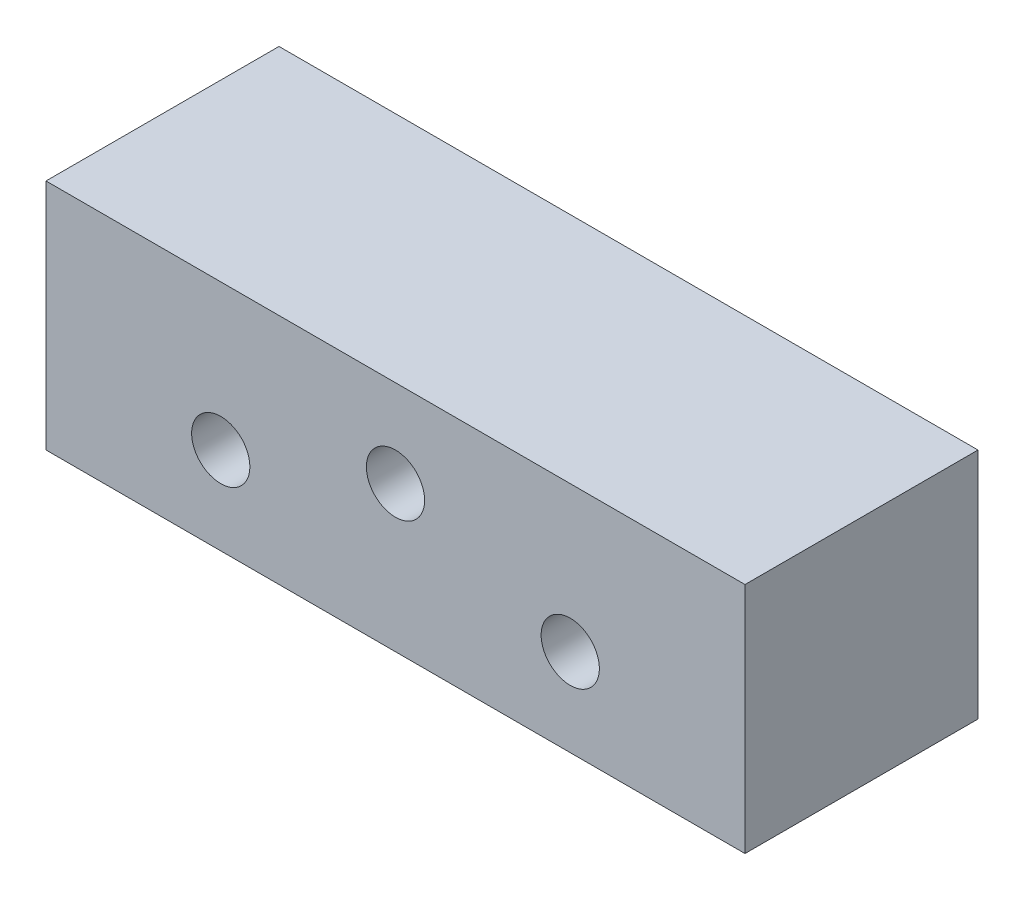
ISO-10303-21;
HEADER;
FILE_DESCRIPTION(('STEP AP214'),'2;1');
FILE_NAME('part.step','',(''),(''),'','','');
FILE_SCHEMA(('AUTOMOTIVE_DESIGN { 1 0 10303 214 1 1 1 1 }'));
ENDSEC;
DATA;
#1=APPLICATION_CONTEXT('core data for automotive mechanical design processes');
#2=APPLICATION_PROTOCOL_DEFINITION('international standard','automotive_design',2000,#1);
#3=PRODUCT_CONTEXT('',#1,'mechanical');
#4=PRODUCT('Part','Part','',(#3));
#5=PRODUCT_RELATED_PRODUCT_CATEGORY('part','',(#4));
#6=PRODUCT_DEFINITION_FORMATION('','',#4);
#7=PRODUCT_DEFINITION_CONTEXT('part definition',#1,'design');
#8=PRODUCT_DEFINITION('design','',#6,#7);
#9=PRODUCT_DEFINITION_SHAPE('','',#8);
#10=(LENGTH_UNIT() NAMED_UNIT(*) SI_UNIT(.MILLI.,.METRE.));
#11=(NAMED_UNIT(*) PLANE_ANGLE_UNIT() SI_UNIT($,.RADIAN.));
#12=(NAMED_UNIT(*) SI_UNIT($,.STERADIAN.) SOLID_ANGLE_UNIT());
#13=UNCERTAINTY_MEASURE_WITH_UNIT(LENGTH_MEASURE(1.E-05),#10,'distance_accuracy_value','');
#14=(GEOMETRIC_REPRESENTATION_CONTEXT(3) GLOBAL_UNCERTAINTY_ASSIGNED_CONTEXT((#13)) GLOBAL_UNIT_ASSIGNED_CONTEXT((#10,
#11,#12)) REPRESENTATION_CONTEXT('',''));
#15=CARTESIAN_POINT('',(0.,0.,0.));
#16=DIRECTION('',(0.,0.,1.));
#17=DIRECTION('',(1.,0.,0.));
#18=AXIS2_PLACEMENT_3D('',#15,#16,#17);
#19=CARTESIAN_POINT('',(0.,0.,40.));
#20=DIRECTION('',(0.,0.,1.));
#21=DIRECTION('',(1.,0.,0.));
#22=AXIS2_PLACEMENT_3D('',#19,#20,#21);
#23=PLANE('',#22);
#24=CARTESIAN_POINT('',(39.8281786941581,-25.,40.));
#25=DIRECTION('',(0.,0.,1.));
#26=DIRECTION('',(1.,0.,0.));
#27=AXIS2_PLACEMENT_3D('',#24,#25,#26);
#28=CIRCLE('',#27,5.);
#29=CARTESIAN_POINT('',(44.8281786941581,-25.,40.));
#30=VERTEX_POINT('',#29);
#31=EDGE_CURVE('E99',#30,#30,#28,.T.);
#32=ORIENTED_EDGE('',*,*,#31,.F.);
#33=EDGE_LOOP('',(#32));
#34=FACE_BOUND('',#33,.T.);
#35=DIRECTION('',(0.,-1.,0.));
#36=VECTOR('',#35,1.);
#37=CARTESIAN_POINT('',(-50.1718213058419,0.,40.));
#38=LINE('',#37,#36);
#39=CARTESIAN_POINT('',(-50.1718213058419,0.,40.));
#40=VERTEX_POINT('',#39);
#41=CARTESIAN_POINT('',(-50.1718213058419,-40.,40.));
#42=VERTEX_POINT('',#41);
#43=EDGE_CURVE('E69',#40,#42,#38,.T.);
#44=ORIENTED_EDGE('',*,*,#43,.T.);
#45=DIRECTION('',(1.,0.,0.));
#46=VECTOR('',#45,1.);
#47=CARTESIAN_POINT('',(-50.1718213058419,-40.,40.));
#48=LINE('',#47,#46);
#49=CARTESIAN_POINT('',(69.8281786941581,-40.,40.));
#50=VERTEX_POINT('',#49);
#51=EDGE_CURVE('E64',#42,#50,#48,.T.);
#52=ORIENTED_EDGE('',*,*,#51,.T.);
#53=DIRECTION('',(0.,1.,0.));
#54=VECTOR('',#53,1.);
#55=CARTESIAN_POINT('',(69.8281786941581,0.,40.));
#56=LINE('',#55,#54);
#57=CARTESIAN_POINT('',(69.8281786941581,0.,40.));
#58=VERTEX_POINT('',#57);
#59=EDGE_CURVE('E67',#50,#58,#56,.T.);
#60=ORIENTED_EDGE('',*,*,#59,.T.);
#61=DIRECTION('',(-1.,0.,0.));
#62=VECTOR('',#61,1.);
#63=CARTESIAN_POINT('',(-50.1718213058419,0.,40.));
#64=LINE('',#63,#62);
#65=EDGE_CURVE('E34',#58,#40,#64,.T.);
#66=ORIENTED_EDGE('',*,*,#65,.T.);
#67=EDGE_LOOP('',(#44,#52,#60,#66));
#68=FACE_BOUND('',#67,.T.);
#69=CARTESIAN_POINT('',(-20.1718213058419,-25.,40.));
#70=DIRECTION('',(0.,0.,1.));
#71=DIRECTION('',(1.,0.,0.));
#72=AXIS2_PLACEMENT_3D('',#69,#70,#71);
#73=CIRCLE('',#72,5.);
#74=CARTESIAN_POINT('',(-15.1718213058419,-25.,40.));
#75=VERTEX_POINT('',#74);
#76=EDGE_CURVE('E84',#75,#75,#73,.T.);
#77=ORIENTED_EDGE('',*,*,#76,.F.);
#78=EDGE_LOOP('',(#77));
#79=FACE_BOUND('',#78,.T.);
#80=CARTESIAN_POINT('',(9.8281786941581,-15.,40.));
#81=DIRECTION('',(0.,0.,1.));
#82=DIRECTION('',(1.,0.,0.));
#83=AXIS2_PLACEMENT_3D('',#80,#81,#82);
#84=CIRCLE('',#83,5.);
#85=CARTESIAN_POINT('',(14.8281786941581,-15.,40.));
#86=VERTEX_POINT('',#85);
#87=EDGE_CURVE('E105',#86,#86,#84,.T.);
#88=ORIENTED_EDGE('',*,*,#87,.F.);
#89=EDGE_LOOP('',(#88));
#90=FACE_BOUND('',#89,.T.);
#91=ADVANCED_FACE('F17',(#34,#68,#79,#90),#23,.T.);
#92=CARTESIAN_POINT('',(0.,0.,0.));
#93=DIRECTION('',(0.,0.,1.));
#94=DIRECTION('',(1.,0.,0.));
#95=AXIS2_PLACEMENT_3D('',#92,#93,#94);
#96=PLANE('',#95);
#97=DIRECTION('',(0.,-1.,0.));
#98=VECTOR('',#97,1.);
#99=CARTESIAN_POINT('',(-50.1718213058419,0.,0.));
#100=LINE('',#99,#98);
#101=CARTESIAN_POINT('',(-50.1718213058419,0.,0.));
#102=VERTEX_POINT('',#101);
#103=CARTESIAN_POINT('',(-50.1718213058419,-40.,0.));
#104=VERTEX_POINT('',#103);
#105=EDGE_CURVE('E81',#102,#104,#100,.T.);
#106=ORIENTED_EDGE('',*,*,#105,.F.);
#107=DIRECTION('',(-1.,0.,0.));
#108=VECTOR('',#107,1.);
#109=CARTESIAN_POINT('',(-50.1718213058419,0.,0.));
#110=LINE('',#109,#108);
#111=CARTESIAN_POINT('',(69.8281786941581,0.,0.));
#112=VERTEX_POINT('',#111);
#113=EDGE_CURVE('E57',#112,#102,#110,.T.);
#114=ORIENTED_EDGE('',*,*,#113,.F.);
#115=DIRECTION('',(0.,1.,0.));
#116=VECTOR('',#115,1.);
#117=CARTESIAN_POINT('',(69.8281786941581,0.,0.));
#118=LINE('',#117,#116);
#119=CARTESIAN_POINT('',(69.8281786941581,-40.,0.));
#120=VERTEX_POINT('',#119);
#121=EDGE_CURVE('E51',#120,#112,#118,.T.);
#122=ORIENTED_EDGE('',*,*,#121,.F.);
#123=DIRECTION('',(1.,0.,0.));
#124=VECTOR('',#123,1.);
#125=CARTESIAN_POINT('',(-50.1718213058419,-40.,0.));
#126=LINE('',#125,#124);
#127=EDGE_CURVE('E73',#104,#120,#126,.T.);
#128=ORIENTED_EDGE('',*,*,#127,.F.);
#129=EDGE_LOOP('',(#106,#114,#122,#128));
#130=FACE_BOUND('',#129,.T.);
#131=CARTESIAN_POINT('',(-20.1718213058419,-25.,0.));
#132=DIRECTION('',(0.,0.,1.));
#133=DIRECTION('',(1.,0.,0.));
#134=AXIS2_PLACEMENT_3D('',#131,#132,#133);
#135=CIRCLE('',#134,5.);
#136=CARTESIAN_POINT('',(-15.1718213058419,-25.,0.));
#137=VERTEX_POINT('',#136);
#138=EDGE_CURVE('E96',#137,#137,#135,.T.);
#139=ORIENTED_EDGE('',*,*,#138,.T.);
#140=EDGE_LOOP('',(#139));
#141=FACE_BOUND('',#140,.T.);
#142=CARTESIAN_POINT('',(39.8281786941581,-25.,0.));
#143=DIRECTION('',(0.,0.,1.));
#144=DIRECTION('',(1.,0.,0.));
#145=AXIS2_PLACEMENT_3D('',#142,#143,#144);
#146=CIRCLE('',#145,5.);
#147=CARTESIAN_POINT('',(44.8281786941581,-25.,0.));
#148=VERTEX_POINT('',#147);
#149=EDGE_CURVE('E102',#148,#148,#146,.T.);
#150=ORIENTED_EDGE('',*,*,#149,.T.);
#151=EDGE_LOOP('',(#150));
#152=FACE_BOUND('',#151,.T.);
#153=CARTESIAN_POINT('',(9.8281786941581,-15.,0.));
#154=DIRECTION('',(0.,0.,1.));
#155=DIRECTION('',(1.,0.,0.));
#156=AXIS2_PLACEMENT_3D('',#153,#154,#155);
#157=CIRCLE('',#156,5.);
#158=CARTESIAN_POINT('',(14.8281786941581,-15.,0.));
#159=VERTEX_POINT('',#158);
#160=EDGE_CURVE('E108',#159,#159,#157,.T.);
#161=ORIENTED_EDGE('',*,*,#160,.T.);
#162=EDGE_LOOP('',(#161));
#163=FACE_BOUND('',#162,.T.);
#164=ADVANCED_FACE('F92',(#130,#141,#152,#163),#96,.F.);
#165=CARTESIAN_POINT('',(-50.1718213058419,0.,40.));
#166=DIRECTION('',(1.,0.,0.));
#167=DIRECTION('',(0.,1.,0.));
#168=AXIS2_PLACEMENT_3D('',#165,#166,#167);
#169=PLANE('',#168);
#170=ORIENTED_EDGE('',*,*,#105,.T.);
#171=DIRECTION('',(0.,0.,-1.));
#172=VECTOR('',#171,1.);
#173=CARTESIAN_POINT('',(-50.1718213058419,-40.,40.));
#174=LINE('',#173,#172);
#175=EDGE_CURVE('E11',#42,#104,#174,.T.);
#176=ORIENTED_EDGE('',*,*,#175,.F.);
#177=ORIENTED_EDGE('',*,*,#43,.F.);
#178=DIRECTION('',(0.,0.,-1.));
#179=VECTOR('',#178,1.);
#180=CARTESIAN_POINT('',(-50.1718213058419,0.,40.));
#181=LINE('',#180,#179);
#182=EDGE_CURVE('E77',#40,#102,#181,.T.);
#183=ORIENTED_EDGE('',*,*,#182,.T.);
#184=EDGE_LOOP('',(#170,#176,#177,#183));
#185=FACE_BOUND('',#184,.T.);
#186=ADVANCED_FACE('F19',(#185),#169,.F.);
#187=CARTESIAN_POINT('',(-50.1718213058419,-40.,40.));
#188=DIRECTION('',(0.,1.,0.));
#189=DIRECTION('',(0.,0.,1.));
#190=AXIS2_PLACEMENT_3D('',#187,#188,#189);
#191=PLANE('',#190);
#192=ORIENTED_EDGE('',*,*,#127,.T.);
#193=DIRECTION('',(0.,0.,-1.));
#194=VECTOR('',#193,1.);
#195=CARTESIAN_POINT('',(69.8281786941581,-40.,40.));
#196=LINE('',#195,#194);
#197=EDGE_CURVE('E26',#50,#120,#196,.T.);
#198=ORIENTED_EDGE('',*,*,#197,.F.);
#199=ORIENTED_EDGE('',*,*,#51,.F.);
#200=ORIENTED_EDGE('',*,*,#175,.T.);
#201=EDGE_LOOP('',(#192,#198,#199,#200));
#202=FACE_BOUND('',#201,.T.);
#203=ADVANCED_FACE('F72',(#202),#191,.F.);
#204=CARTESIAN_POINT('',(69.8281786941581,0.,40.));
#205=DIRECTION('',(-1.,0.,0.));
#206=DIRECTION('',(0.,-1.,0.));
#207=AXIS2_PLACEMENT_3D('',#204,#205,#206);
#208=PLANE('',#207);
#209=ORIENTED_EDGE('',*,*,#121,.T.);
#210=DIRECTION('',(0.,0.,-1.));
#211=VECTOR('',#210,1.);
#212=CARTESIAN_POINT('',(69.8281786941581,0.,40.));
#213=LINE('',#212,#211);
#214=EDGE_CURVE('E74',#58,#112,#213,.T.);
#215=ORIENTED_EDGE('',*,*,#214,.F.);
#216=ORIENTED_EDGE('',*,*,#59,.F.);
#217=ORIENTED_EDGE('',*,*,#197,.T.);
#218=EDGE_LOOP('',(#209,#215,#216,#217));
#219=FACE_BOUND('',#218,.T.);
#220=ADVANCED_FACE('F75',(#219),#208,.F.);
#221=CARTESIAN_POINT('',(-50.1718213058419,0.,40.));
#222=DIRECTION('',(0.,-1.,0.));
#223=DIRECTION('',(0.,0.,-1.));
#224=AXIS2_PLACEMENT_3D('',#221,#222,#223);
#225=PLANE('',#224);
#226=ORIENTED_EDGE('',*,*,#113,.T.);
#227=ORIENTED_EDGE('',*,*,#182,.F.);
#228=ORIENTED_EDGE('',*,*,#65,.F.);
#229=ORIENTED_EDGE('',*,*,#214,.T.);
#230=EDGE_LOOP('',(#226,#227,#228,#229));
#231=FACE_BOUND('',#230,.T.);
#232=ADVANCED_FACE('F89',(#231),#225,.F.);
#233=CARTESIAN_POINT('',(-20.1718213058419,-25.,40.));
#234=DIRECTION('',(0.,0.,-1.));
#235=DIRECTION('',(-1.,0.,0.));
#236=AXIS2_PLACEMENT_3D('',#233,#234,#235);
#237=CYLINDRICAL_SURFACE('',#236,5.);
#238=ORIENTED_EDGE('',*,*,#76,.T.);
#239=EDGE_LOOP('',(#238));
#240=FACE_BOUND('',#239,.T.);
#241=ORIENTED_EDGE('',*,*,#138,.F.);
#242=EDGE_LOOP('',(#241));
#243=FACE_BOUND('',#242,.T.);
#244=ADVANCED_FACE('F128',(#240,#243),#237,.F.);
#245=CARTESIAN_POINT('',(39.8281786941581,-25.,40.));
#246=DIRECTION('',(0.,0.,-1.));
#247=DIRECTION('',(-1.,0.,0.));
#248=AXIS2_PLACEMENT_3D('',#245,#246,#247);
#249=CYLINDRICAL_SURFACE('',#248,5.);
#250=ORIENTED_EDGE('',*,*,#31,.T.);
#251=EDGE_LOOP('',(#250));
#252=FACE_BOUND('',#251,.T.);
#253=ORIENTED_EDGE('',*,*,#149,.F.);
#254=EDGE_LOOP('',(#253));
#255=FACE_BOUND('',#254,.T.);
#256=ADVANCED_FACE('F177',(#252,#255),#249,.F.);
#257=CARTESIAN_POINT('',(9.8281786941581,-15.,40.));
#258=DIRECTION('',(0.,0.,-1.));
#259=DIRECTION('',(-1.,0.,0.));
#260=AXIS2_PLACEMENT_3D('',#257,#258,#259);
#261=CYLINDRICAL_SURFACE('',#260,5.);
#262=ORIENTED_EDGE('',*,*,#87,.T.);
#263=EDGE_LOOP('',(#262));
#264=FACE_BOUND('',#263,.T.);
#265=ORIENTED_EDGE('',*,*,#160,.F.);
#266=EDGE_LOOP('',(#265));
#267=FACE_BOUND('',#266,.T.);
#268=ADVANCED_FACE('F114',(#264,#267),#261,.F.);
#269=CLOSED_SHELL('',(#91,#164,#186,#203,#220,#232,#244,#256,#268));
#270=MANIFOLD_SOLID_BREP('B1',#269);
#271=ADVANCED_BREP_SHAPE_REPRESENTATION('',(#18,#270),#14);
#272=SHAPE_DEFINITION_REPRESENTATION(#9,#271);
ENDSEC;
END-ISO-10303-21;
